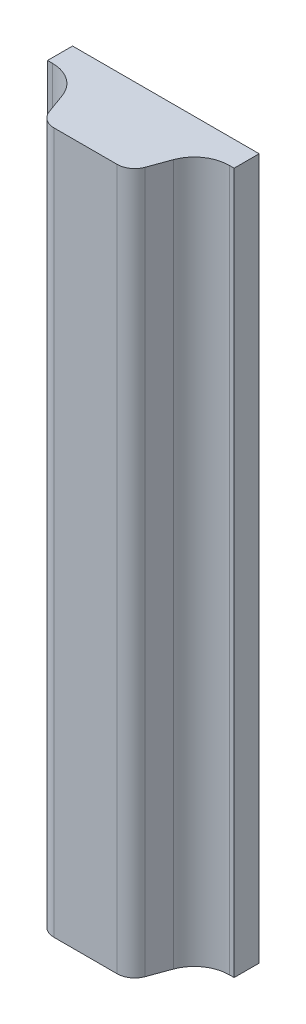
ISO-10303-21;
HEADER;
FILE_DESCRIPTION(('STEP AP214'),'2;1');
FILE_NAME('part.step','',(''),(''),'','','');
FILE_SCHEMA(('AUTOMOTIVE_DESIGN { 1 0 10303 214 1 1 1 1 }'));
ENDSEC;
DATA;
#1=APPLICATION_CONTEXT('core data for automotive mechanical design processes');
#2=APPLICATION_PROTOCOL_DEFINITION('international standard','automotive_design',2000,#1);
#3=PRODUCT_CONTEXT('',#1,'mechanical');
#4=PRODUCT('Part','Part','',(#3));
#5=PRODUCT_RELATED_PRODUCT_CATEGORY('part','',(#4));
#6=PRODUCT_DEFINITION_FORMATION('','',#4);
#7=PRODUCT_DEFINITION_CONTEXT('part definition',#1,'design');
#8=PRODUCT_DEFINITION('design','',#6,#7);
#9=PRODUCT_DEFINITION_SHAPE('','',#8);
#10=(LENGTH_UNIT() NAMED_UNIT(*) SI_UNIT(.MILLI.,.METRE.));
#11=(NAMED_UNIT(*) PLANE_ANGLE_UNIT() SI_UNIT($,.RADIAN.));
#12=(NAMED_UNIT(*) SI_UNIT($,.STERADIAN.) SOLID_ANGLE_UNIT());
#13=UNCERTAINTY_MEASURE_WITH_UNIT(LENGTH_MEASURE(1.E-05),#10,'distance_accuracy_value','');
#14=(GEOMETRIC_REPRESENTATION_CONTEXT(3) GLOBAL_UNCERTAINTY_ASSIGNED_CONTEXT((#13)) GLOBAL_UNIT_ASSIGNED_CONTEXT((#10,
#11,#12)) REPRESENTATION_CONTEXT('',''));
#15=CARTESIAN_POINT('',(0.,0.,0.));
#16=DIRECTION('',(0.,0.,1.));
#17=DIRECTION('',(1.,0.,0.));
#18=AXIS2_PLACEMENT_3D('',#15,#16,#17);
#19=CARTESIAN_POINT('',(3.99312578412241,8.,0.277749900569691));
#20=DIRECTION('',(0.,-1.,0.));
#21=DIRECTION('',(0.,0.,-1.));
#22=AXIS2_PLACEMENT_3D('',#19,#20,#21);
#23=CYLINDRICAL_SURFACE('',#22,0.2);
#24=CARTESIAN_POINT('',(3.99312578412241,0.,0.277749900569691));
#25=DIRECTION('',(0.,1.,0.));
#26=DIRECTION('',(0.,0.,1.));
#27=AXIS2_PLACEMENT_3D('',#24,#25,#26);
#28=CIRCLE('',#27,0.2);
#29=CARTESIAN_POINT('',(3.99312578412241,0.,0.477749900569691));
#30=VERTEX_POINT('',#29);
#31=CARTESIAN_POINT('',(4.18106430827959,0.,0.346153929234825));
#32=VERTEX_POINT('',#31);
#33=EDGE_CURVE('E158',#30,#32,#28,.T.);
#34=ORIENTED_EDGE('',*,*,#33,.T.);
#35=DIRECTION('',(0.,-1.,0.));
#36=VECTOR('',#35,1.);
#37=CARTESIAN_POINT('',(4.18106430827959,8.,0.346153929234825));
#38=LINE('',#37,#36);
#39=CARTESIAN_POINT('',(4.18106430827959,8.,0.346153929234825));
#40=VERTEX_POINT('',#39);
#41=EDGE_CURVE('E11',#40,#32,#38,.T.);
#42=ORIENTED_EDGE('',*,*,#41,.F.);
#43=CARTESIAN_POINT('',(3.99312578412241,8.,0.277749900569691));
#44=DIRECTION('',(0.,1.,0.));
#45=DIRECTION('',(0.,0.,1.));
#46=AXIS2_PLACEMENT_3D('',#43,#44,#45);
#47=CIRCLE('',#46,0.2);
#48=CARTESIAN_POINT('',(3.99312578412241,8.,0.477749900569691));
#49=VERTEX_POINT('',#48);
#50=EDGE_CURVE('E180',#49,#40,#47,.T.);
#51=ORIENTED_EDGE('',*,*,#50,.F.);
#52=DIRECTION('',(0.,-1.,0.));
#53=VECTOR('',#52,1.);
#54=CARTESIAN_POINT('',(3.99312578412241,8.,0.477749900569691));
#55=LINE('',#54,#53);
#56=EDGE_CURVE('E154',#49,#30,#55,.T.);
#57=ORIENTED_EDGE('',*,*,#56,.T.);
#58=EDGE_LOOP('',(#34,#42,#51,#57));
#59=FACE_BOUND('',#58,.T.);
#60=ADVANCED_FACE('F38',(#59),#23,.T.);
#61=CARTESIAN_POINT('',(4.18106430827959,8.,0.346153929234825));
#62=DIRECTION('',(-0.939692620785906,0.,-0.342020143325674));
#63=DIRECTION('',(-0.342020143325674,0.,0.939692620785906));
#64=AXIS2_PLACEMENT_3D('',#61,#62,#63);
#65=PLANE('',#64);
#66=DIRECTION('',(0.342020143325674,0.,-0.939692620785906));
#67=VECTOR('',#66,1.);
#68=CARTESIAN_POINT('',(4.18106430827959,0.,0.346153929234825));
#69=LINE('',#68,#67);
#70=CARTESIAN_POINT('',(4.2666324292147,0.,0.11105744914046));
#71=VERTEX_POINT('',#70);
#72=EDGE_CURVE('E161',#32,#71,#69,.T.);
#73=ORIENTED_EDGE('',*,*,#72,.T.);
#74=DIRECTION('',(0.,-1.,0.));
#75=VECTOR('',#74,1.);
#76=CARTESIAN_POINT('',(4.2666324292147,8.,0.11105744914046));
#77=LINE('',#76,#75);
#78=CARTESIAN_POINT('',(4.2666324292147,8.,0.11105744914046));
#79=VERTEX_POINT('',#78);
#80=EDGE_CURVE('E46',#79,#71,#77,.T.);
#81=ORIENTED_EDGE('',*,*,#80,.F.);
#82=DIRECTION('',(0.342020143325674,0.,-0.939692620785906));
#83=VECTOR('',#82,1.);
#84=CARTESIAN_POINT('',(4.18106430827959,8.,0.346153929234825));
#85=LINE('',#84,#83);
#86=EDGE_CURVE('E109',#40,#79,#85,.T.);
#87=ORIENTED_EDGE('',*,*,#86,.F.);
#88=ORIENTED_EDGE('',*,*,#41,.T.);
#89=EDGE_LOOP('',(#73,#81,#87,#88));
#90=FACE_BOUND('',#89,.T.);
#91=ADVANCED_FACE('F258',(#90),#65,.F.);
#92=CARTESIAN_POINT('',(4.64250947752906,8.,0.247865506470728));
#93=DIRECTION('',(0.,-1.,0.));
#94=DIRECTION('',(0.,0.,-1.));
#95=AXIS2_PLACEMENT_3D('',#92,#93,#94);
#96=CYLINDRICAL_SURFACE('',#95,0.4);
#97=CARTESIAN_POINT('',(4.64250947752906,0.,0.247865506470728));
#98=DIRECTION('',(0.,-1.,0.));
#99=DIRECTION('',(0.,0.,1.));
#100=AXIS2_PLACEMENT_3D('',#97,#98,#99);
#101=CIRCLE('',#100,0.4);
#102=CARTESIAN_POINT('',(4.64250947752906,0.,-0.152134493529272));
#103=VERTEX_POINT('',#102);
#104=EDGE_CURVE('E163',#71,#103,#101,.T.);
#105=ORIENTED_EDGE('',*,*,#104,.T.);
#106=DIRECTION('',(0.,-1.,0.));
#107=VECTOR('',#106,1.);
#108=CARTESIAN_POINT('',(4.64250947752906,8.,-0.152134493529272));
#109=LINE('',#108,#107);
#110=CARTESIAN_POINT('',(4.64250947752906,8.,-0.152134493529272));
#111=VERTEX_POINT('',#110);
#112=EDGE_CURVE('E199',#111,#103,#109,.T.);
#113=ORIENTED_EDGE('',*,*,#112,.F.);
#114=CARTESIAN_POINT('',(4.64250947752906,8.,0.247865506470728));
#115=DIRECTION('',(0.,-1.,0.));
#116=DIRECTION('',(0.,0.,1.));
#117=AXIS2_PLACEMENT_3D('',#114,#115,#116);
#118=CIRCLE('',#117,0.4);
#119=EDGE_CURVE('E207',#79,#111,#118,.T.);
#120=ORIENTED_EDGE('',*,*,#119,.F.);
#121=ORIENTED_EDGE('',*,*,#80,.T.);
#122=EDGE_LOOP('',(#105,#113,#120,#121));
#123=FACE_BOUND('',#122,.T.);
#124=ADVANCED_FACE('F205',(#123),#96,.F.);
#125=CARTESIAN_POINT('',(4.64250947752906,8.,-0.152134493529272));
#126=DIRECTION('',(0.,0.,-1.));
#127=DIRECTION('',(-1.,0.,0.));
#128=AXIS2_PLACEMENT_3D('',#125,#126,#127);
#129=PLANE('',#128);
#130=DIRECTION('',(1.,0.,0.));
#131=VECTOR('',#130,1.);
#132=CARTESIAN_POINT('',(4.64250947752906,0.,-0.152134493529272));
#133=LINE('',#132,#131);
#134=CARTESIAN_POINT('',(4.69781589866686,0.,-0.152134493529272));
#135=VERTEX_POINT('',#134);
#136=EDGE_CURVE('E165',#103,#135,#133,.T.);
#137=ORIENTED_EDGE('',*,*,#136,.T.);
#138=DIRECTION('',(0.,-1.,0.));
#139=VECTOR('',#138,1.);
#140=CARTESIAN_POINT('',(4.69781589866686,8.,-0.152134493529272));
#141=LINE('',#140,#139);
#142=CARTESIAN_POINT('',(4.69781589866686,8.,-0.152134493529272));
#143=VERTEX_POINT('',#142);
#144=EDGE_CURVE('E196',#143,#135,#141,.T.);
#145=ORIENTED_EDGE('',*,*,#144,.F.);
#146=DIRECTION('',(1.,0.,0.));
#147=VECTOR('',#146,1.);
#148=CARTESIAN_POINT('',(4.64250947752906,8.,-0.152134493529272));
#149=LINE('',#148,#147);
#150=EDGE_CURVE('E225',#111,#143,#149,.T.);
#151=ORIENTED_EDGE('',*,*,#150,.F.);
#152=ORIENTED_EDGE('',*,*,#112,.T.);
#153=EDGE_LOOP('',(#137,#145,#151,#152));
#154=FACE_BOUND('',#153,.T.);
#155=ADVANCED_FACE('F216',(#154),#129,.F.);
#156=CARTESIAN_POINT('',(4.69781589866686,8.,-0.152134493529272));
#157=DIRECTION('',(-1.,0.,0.));
#158=DIRECTION('',(0.,0.,1.));
#159=AXIS2_PLACEMENT_3D('',#156,#157,#158);
#160=PLANE('',#159);
#161=DIRECTION('',(0.,0.,-1.));
#162=VECTOR('',#161,1.);
#163=CARTESIAN_POINT('',(4.69781589866686,0.,-0.152134493529272));
#164=LINE('',#163,#162);
#165=CARTESIAN_POINT('',(4.69781589866686,0.,-0.437587250490366));
#166=VERTEX_POINT('',#165);
#167=EDGE_CURVE('E167',#135,#166,#164,.T.);
#168=ORIENTED_EDGE('',*,*,#167,.T.);
#169=DIRECTION('',(0.,-1.,0.));
#170=VECTOR('',#169,1.);
#171=CARTESIAN_POINT('',(4.69781589866686,8.,-0.437587250490366));
#172=LINE('',#171,#170);
#173=CARTESIAN_POINT('',(4.69781589866686,8.,-0.437587250490366));
#174=VERTEX_POINT('',#173);
#175=EDGE_CURVE('E193',#174,#166,#172,.T.);
#176=ORIENTED_EDGE('',*,*,#175,.F.);
#177=DIRECTION('',(0.,0.,-1.));
#178=VECTOR('',#177,1.);
#179=CARTESIAN_POINT('',(4.69781589866686,8.,-0.152134493529272));
#180=LINE('',#179,#178);
#181=EDGE_CURVE('E222',#143,#174,#180,.T.);
#182=ORIENTED_EDGE('',*,*,#181,.F.);
#183=ORIENTED_EDGE('',*,*,#144,.T.);
#184=EDGE_LOOP('',(#168,#176,#182,#183));
#185=FACE_BOUND('',#184,.T.);
#186=ADVANCED_FACE('F220',(#185),#160,.F.);
#187=CARTESIAN_POINT('',(4.69781589866686,8.,-0.437587250490366));
#188=DIRECTION('',(0.,0.,1.));
#189=DIRECTION('',(1.,0.,0.));
#190=AXIS2_PLACEMENT_3D('',#187,#188,#189);
#191=PLANE('',#190);
#192=DIRECTION('',(-1.,0.,0.));
#193=VECTOR('',#192,1.);
#194=CARTESIAN_POINT('',(4.69781589866686,0.,-0.437587250490366));
#195=LINE('',#194,#193);
#196=CARTESIAN_POINT('',(2.56851868486185,0.,-0.437587250490366));
#197=VERTEX_POINT('',#196);
#198=EDGE_CURVE('E169',#166,#197,#195,.T.);
#199=ORIENTED_EDGE('',*,*,#198,.T.);
#200=DIRECTION('',(0.,-1.,0.));
#201=VECTOR('',#200,1.);
#202=CARTESIAN_POINT('',(2.56851868486185,8.,-0.437587250490366));
#203=LINE('',#202,#201);
#204=CARTESIAN_POINT('',(2.56851868486185,8.,-0.437587250490366));
#205=VERTEX_POINT('',#204);
#206=EDGE_CURVE('E190',#205,#197,#203,.T.);
#207=ORIENTED_EDGE('',*,*,#206,.F.);
#208=DIRECTION('',(-1.,0.,0.));
#209=VECTOR('',#208,1.);
#210=CARTESIAN_POINT('',(4.69781589866686,8.,-0.437587250490366));
#211=LINE('',#210,#209);
#212=EDGE_CURVE('E224',#174,#205,#211,.T.);
#213=ORIENTED_EDGE('',*,*,#212,.F.);
#214=ORIENTED_EDGE('',*,*,#175,.T.);
#215=EDGE_LOOP('',(#199,#207,#213,#214));
#216=FACE_BOUND('',#215,.T.);
#217=ADVANCED_FACE('F271',(#216),#191,.F.);
#218=CARTESIAN_POINT('',(2.56851868486185,8.,-0.437587250490366));
#219=DIRECTION('',(1.,0.,0.));
#220=DIRECTION('',(0.,0.,-1.));
#221=AXIS2_PLACEMENT_3D('',#218,#219,#220);
#222=PLANE('',#221);
#223=DIRECTION('',(0.,0.,1.));
#224=VECTOR('',#223,1.);
#225=CARTESIAN_POINT('',(2.56851868486185,0.,-0.437587250490366));
#226=LINE('',#225,#224);
#227=CARTESIAN_POINT('',(2.56851868486185,0.,-0.152134493529272));
#228=VERTEX_POINT('',#227);
#229=EDGE_CURVE('E171',#197,#228,#226,.T.);
#230=ORIENTED_EDGE('',*,*,#229,.T.);
#231=DIRECTION('',(0.,-1.,0.));
#232=VECTOR('',#231,1.);
#233=CARTESIAN_POINT('',(2.56851868486185,8.,-0.152134493529272));
#234=LINE('',#233,#232);
#235=CARTESIAN_POINT('',(2.56851868486185,8.,-0.152134493529272));
#236=VERTEX_POINT('',#235);
#237=EDGE_CURVE('E187',#236,#228,#234,.T.);
#238=ORIENTED_EDGE('',*,*,#237,.F.);
#239=DIRECTION('',(0.,0.,1.));
#240=VECTOR('',#239,1.);
#241=CARTESIAN_POINT('',(2.56851868486185,8.,-0.437587250490366));
#242=LINE('',#241,#240);
#243=EDGE_CURVE('E227',#205,#236,#242,.T.);
#244=ORIENTED_EDGE('',*,*,#243,.F.);
#245=ORIENTED_EDGE('',*,*,#206,.T.);
#246=EDGE_LOOP('',(#230,#238,#244,#245));
#247=FACE_BOUND('',#246,.T.);
#248=ADVANCED_FACE('F274',(#247),#222,.F.);
#249=CARTESIAN_POINT('',(2.62382510599965,8.,-0.152134493529272));
#250=DIRECTION('',(0.,0.,-1.));
#251=DIRECTION('',(-1.,0.,0.));
#252=AXIS2_PLACEMENT_3D('',#249,#250,#251);
#253=PLANE('',#252);
#254=DIRECTION('',(1.,0.,0.));
#255=VECTOR('',#254,1.);
#256=CARTESIAN_POINT('',(2.62382510599965,0.,-0.152134493529272));
#257=LINE('',#256,#255);
#258=CARTESIAN_POINT('',(2.62382510599965,0.,-0.152134493529272));
#259=VERTEX_POINT('',#258);
#260=EDGE_CURVE('E173',#228,#259,#257,.T.);
#261=ORIENTED_EDGE('',*,*,#260,.T.);
#262=DIRECTION('',(0.,-1.,0.));
#263=VECTOR('',#262,1.);
#264=CARTESIAN_POINT('',(2.62382510599965,8.,-0.152134493529272));
#265=LINE('',#264,#263);
#266=CARTESIAN_POINT('',(2.62382510599965,8.,-0.152134493529272));
#267=VERTEX_POINT('',#266);
#268=EDGE_CURVE('E184',#267,#259,#265,.T.);
#269=ORIENTED_EDGE('',*,*,#268,.F.);
#270=DIRECTION('',(1.,0.,0.));
#271=VECTOR('',#270,1.);
#272=CARTESIAN_POINT('',(2.62382510599965,8.,-0.152134493529272));
#273=LINE('',#272,#271);
#274=EDGE_CURVE('E233',#236,#267,#273,.T.);
#275=ORIENTED_EDGE('',*,*,#274,.F.);
#276=ORIENTED_EDGE('',*,*,#237,.T.);
#277=EDGE_LOOP('',(#261,#269,#275,#276));
#278=FACE_BOUND('',#277,.T.);
#279=ADVANCED_FACE('F239',(#278),#253,.F.);
#280=CARTESIAN_POINT('',(2.62382510599965,8.,0.247865506470728));
#281=DIRECTION('',(0.,-1.,0.));
#282=DIRECTION('',(0.,0.,-1.));
#283=AXIS2_PLACEMENT_3D('',#280,#281,#282);
#284=CYLINDRICAL_SURFACE('',#283,0.4);
#285=CARTESIAN_POINT('',(2.62382510599965,0.,0.247865506470728));
#286=DIRECTION('',(0.,-1.,0.));
#287=DIRECTION('',(0.,0.,1.));
#288=AXIS2_PLACEMENT_3D('',#285,#286,#287);
#289=CIRCLE('',#288,0.4);
#290=CARTESIAN_POINT('',(2.99970215431401,0.,0.11105744914046));
#291=VERTEX_POINT('',#290);
#292=EDGE_CURVE('E175',#259,#291,#289,.T.);
#293=ORIENTED_EDGE('',*,*,#292,.T.);
#294=DIRECTION('',(0.,-1.,0.));
#295=VECTOR('',#294,1.);
#296=CARTESIAN_POINT('',(2.99970215431401,8.,0.11105744914046));
#297=LINE('',#296,#295);
#298=CARTESIAN_POINT('',(2.99970215431401,8.,0.11105744914046));
#299=VERTEX_POINT('',#298);
#300=EDGE_CURVE('E149',#299,#291,#297,.T.);
#301=ORIENTED_EDGE('',*,*,#300,.F.);
#302=CARTESIAN_POINT('',(2.62382510599965,8.,0.247865506470728));
#303=DIRECTION('',(0.,-1.,0.));
#304=DIRECTION('',(0.,0.,1.));
#305=AXIS2_PLACEMENT_3D('',#302,#303,#304);
#306=CIRCLE('',#305,0.4);
#307=EDGE_CURVE('E140',#267,#299,#306,.T.);
#308=ORIENTED_EDGE('',*,*,#307,.F.);
#309=ORIENTED_EDGE('',*,*,#268,.T.);
#310=EDGE_LOOP('',(#293,#301,#308,#309));
#311=FACE_BOUND('',#310,.T.);
#312=ADVANCED_FACE('F243',(#311),#284,.F.);
#313=CARTESIAN_POINT('',(3.08527027524912,8.,0.346153929234825));
#314=DIRECTION('',(0.939692620785908,0.,-0.342020143325671));
#315=DIRECTION('',(-0.342020143325671,0.,-0.939692620785908));
#316=AXIS2_PLACEMENT_3D('',#313,#314,#315);
#317=PLANE('',#316);
#318=DIRECTION('',(0.342020143325671,0.,0.939692620785908));
#319=VECTOR('',#318,1.);
#320=CARTESIAN_POINT('',(3.08527027524912,0.,0.346153929234825));
#321=LINE('',#320,#319);
#322=CARTESIAN_POINT('',(3.08527027524912,0.,0.346153929234825));
#323=VERTEX_POINT('',#322);
#324=EDGE_CURVE('E148',#291,#323,#321,.T.);
#325=ORIENTED_EDGE('',*,*,#324,.T.);
#326=DIRECTION('',(0.,-1.,0.));
#327=VECTOR('',#326,1.);
#328=CARTESIAN_POINT('',(3.08527027524912,8.,0.346153929234825));
#329=LINE('',#328,#327);
#330=CARTESIAN_POINT('',(3.08527027524912,8.,0.346153929234825));
#331=VERTEX_POINT('',#330);
#332=EDGE_CURVE('E145',#331,#323,#329,.T.);
#333=ORIENTED_EDGE('',*,*,#332,.F.);
#334=DIRECTION('',(0.342020143325671,0.,0.939692620785908));
#335=VECTOR('',#334,1.);
#336=CARTESIAN_POINT('',(3.08527027524912,8.,0.346153929234825));
#337=LINE('',#336,#335);
#338=EDGE_CURVE('E134',#299,#331,#337,.T.);
#339=ORIENTED_EDGE('',*,*,#338,.F.);
#340=ORIENTED_EDGE('',*,*,#300,.T.);
#341=EDGE_LOOP('',(#325,#333,#339,#340));
#342=FACE_BOUND('',#341,.T.);
#343=ADVANCED_FACE('F146',(#342),#317,.F.);
#344=CARTESIAN_POINT('',(3.2732087994063,8.,0.277749900569691));
#345=DIRECTION('',(0.,-1.,0.));
#346=DIRECTION('',(0.,0.,-1.));
#347=AXIS2_PLACEMENT_3D('',#344,#345,#346);
#348=CYLINDRICAL_SURFACE('',#347,0.2);
#349=CARTESIAN_POINT('',(3.2732087994063,0.,0.277749900569691));
#350=DIRECTION('',(0.,1.,0.));
#351=DIRECTION('',(0.,0.,1.));
#352=AXIS2_PLACEMENT_3D('',#349,#350,#351);
#353=CIRCLE('',#352,0.2);
#354=CARTESIAN_POINT('',(3.2732087994063,0.,0.477749900569691));
#355=VERTEX_POINT('',#354);
#356=EDGE_CURVE('E95',#323,#355,#353,.T.);
#357=ORIENTED_EDGE('',*,*,#356,.T.);
#358=DIRECTION('',(0.,-1.,0.));
#359=VECTOR('',#358,1.);
#360=CARTESIAN_POINT('',(3.2732087994063,8.,0.477749900569691));
#361=LINE('',#360,#359);
#362=CARTESIAN_POINT('',(3.2732087994063,8.,0.477749900569691));
#363=VERTEX_POINT('',#362);
#364=EDGE_CURVE('E150',#363,#355,#361,.T.);
#365=ORIENTED_EDGE('',*,*,#364,.F.);
#366=CARTESIAN_POINT('',(3.2732087994063,8.,0.277749900569691));
#367=DIRECTION('',(0.,1.,0.));
#368=DIRECTION('',(0.,0.,1.));
#369=AXIS2_PLACEMENT_3D('',#366,#367,#368);
#370=CIRCLE('',#369,0.2);
#371=EDGE_CURVE('E138',#331,#363,#370,.T.);
#372=ORIENTED_EDGE('',*,*,#371,.F.);
#373=ORIENTED_EDGE('',*,*,#332,.T.);
#374=EDGE_LOOP('',(#357,#365,#372,#373));
#375=FACE_BOUND('',#374,.T.);
#376=ADVANCED_FACE('F152',(#375),#348,.T.);
#377=CARTESIAN_POINT('',(3.2732087994063,8.,0.477749900569691));
#378=DIRECTION('',(0.,0.,-1.));
#379=DIRECTION('',(-1.,0.,0.));
#380=AXIS2_PLACEMENT_3D('',#377,#378,#379);
#381=PLANE('',#380);
#382=DIRECTION('',(1.,0.,0.));
#383=VECTOR('',#382,1.);
#384=CARTESIAN_POINT('',(3.2732087994063,0.,0.477749900569691));
#385=LINE('',#384,#383);
#386=EDGE_CURVE('E101',#355,#30,#385,.T.);
#387=ORIENTED_EDGE('',*,*,#386,.T.);
#388=ORIENTED_EDGE('',*,*,#56,.F.);
#389=DIRECTION('',(1.,0.,0.));
#390=VECTOR('',#389,1.);
#391=CARTESIAN_POINT('',(3.2732087994063,8.,0.477749900569691));
#392=LINE('',#391,#390);
#393=EDGE_CURVE('E54',#363,#49,#392,.T.);
#394=ORIENTED_EDGE('',*,*,#393,.F.);
#395=ORIENTED_EDGE('',*,*,#364,.T.);
#396=EDGE_LOOP('',(#387,#388,#394,#395));
#397=FACE_BOUND('',#396,.T.);
#398=ADVANCED_FACE('F247',(#397),#381,.F.);
#399=CARTESIAN_POINT('',(3.99312578412241,8.,0.277749900569691));
#400=DIRECTION('',(0.,1.,0.));
#401=DIRECTION('',(0.,0.,1.));
#402=AXIS2_PLACEMENT_3D('',#399,#400,#401);
#403=PLANE('',#402);
#404=ORIENTED_EDGE('',*,*,#50,.T.);
#405=ORIENTED_EDGE('',*,*,#86,.T.);
#406=ORIENTED_EDGE('',*,*,#119,.T.);
#407=ORIENTED_EDGE('',*,*,#150,.T.);
#408=ORIENTED_EDGE('',*,*,#181,.T.);
#409=ORIENTED_EDGE('',*,*,#212,.T.);
#410=ORIENTED_EDGE('',*,*,#243,.T.);
#411=ORIENTED_EDGE('',*,*,#274,.T.);
#412=ORIENTED_EDGE('',*,*,#307,.T.);
#413=ORIENTED_EDGE('',*,*,#338,.T.);
#414=ORIENTED_EDGE('',*,*,#371,.T.);
#415=ORIENTED_EDGE('',*,*,#393,.T.);
#416=EDGE_LOOP('',(#404,#405,#406,#407,#408,#409,#410,#411,#412,#413,#414,#415));
#417=FACE_BOUND('',#416,.T.);
#418=ADVANCED_FACE('F136',(#417),#403,.T.);
#419=CARTESIAN_POINT('',(3.99312578412241,0.,0.277749900569691));
#420=DIRECTION('',(0.,1.,0.));
#421=DIRECTION('',(0.,0.,1.));
#422=AXIS2_PLACEMENT_3D('',#419,#420,#421);
#423=PLANE('',#422);
#424=ORIENTED_EDGE('',*,*,#33,.F.);
#425=ORIENTED_EDGE('',*,*,#386,.F.);
#426=ORIENTED_EDGE('',*,*,#356,.F.);
#427=ORIENTED_EDGE('',*,*,#324,.F.);
#428=ORIENTED_EDGE('',*,*,#292,.F.);
#429=ORIENTED_EDGE('',*,*,#260,.F.);
#430=ORIENTED_EDGE('',*,*,#229,.F.);
#431=ORIENTED_EDGE('',*,*,#198,.F.);
#432=ORIENTED_EDGE('',*,*,#167,.F.);
#433=ORIENTED_EDGE('',*,*,#136,.F.);
#434=ORIENTED_EDGE('',*,*,#104,.F.);
#435=ORIENTED_EDGE('',*,*,#72,.F.);
#436=EDGE_LOOP('',(#424,#425,#426,#427,#428,#429,#430,#431,#432,#433,#434,#435));
#437=FACE_BOUND('',#436,.T.);
#438=ADVANCED_FACE('F211',(#437),#423,.F.);
#439=CLOSED_SHELL('',(#60,#91,#124,#155,#186,#217,#248,#279,#312,#343,#376,#398,#418,#438));
#440=MANIFOLD_SOLID_BREP('B2',#439);
#441=ADVANCED_BREP_SHAPE_REPRESENTATION('',(#18,#440),#14);
#442=SHAPE_DEFINITION_REPRESENTATION(#9,#441);
ENDSEC;
END-ISO-10303-21;
